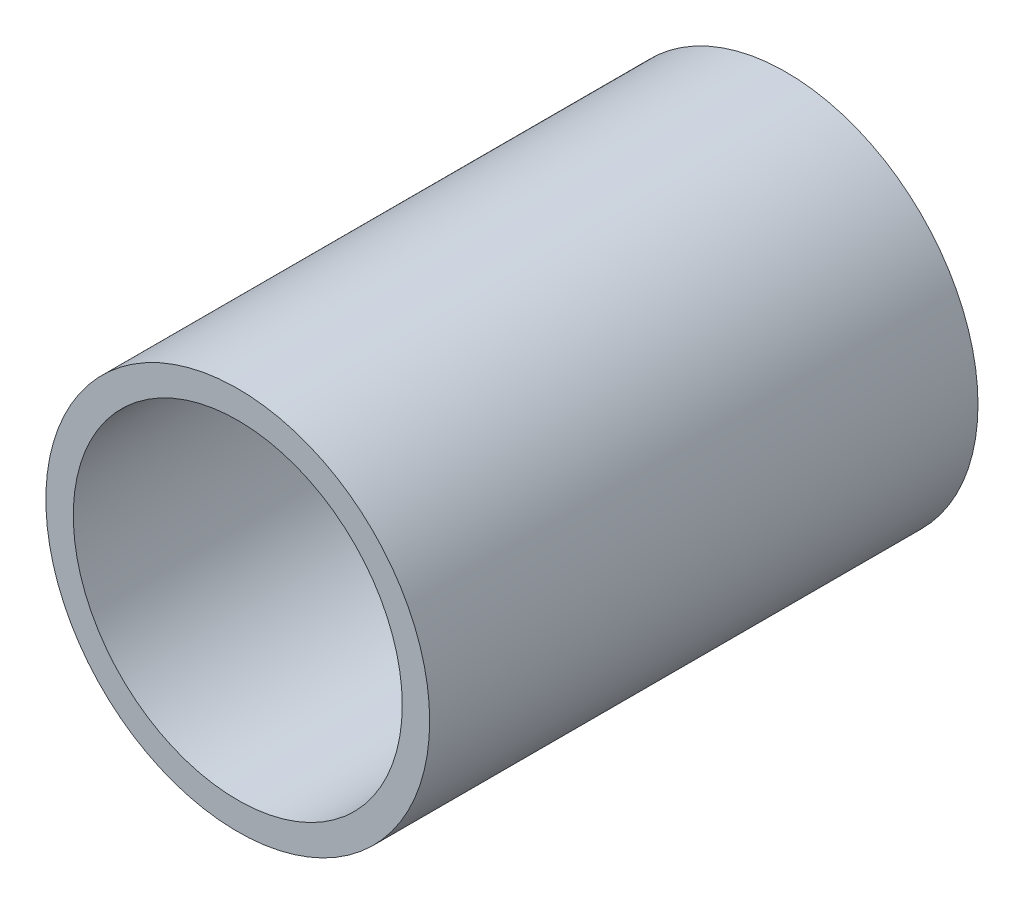
ISO-10303-21;
HEADER;
FILE_DESCRIPTION(('STEP AP214'),'2;1');
FILE_NAME('part.step','',(''),(''),'','','');
FILE_SCHEMA(('AUTOMOTIVE_DESIGN { 1 0 10303 214 1 1 1 1 }'));
ENDSEC;
DATA;
#1=APPLICATION_CONTEXT('core data for automotive mechanical design processes');
#2=APPLICATION_PROTOCOL_DEFINITION('international standard','automotive_design',2000,#1);
#3=PRODUCT_CONTEXT('',#1,'mechanical');
#4=PRODUCT('Part','Part','',(#3));
#5=PRODUCT_RELATED_PRODUCT_CATEGORY('part','',(#4));
#6=PRODUCT_DEFINITION_FORMATION('','',#4);
#7=PRODUCT_DEFINITION_CONTEXT('part definition',#1,'design');
#8=PRODUCT_DEFINITION('design','',#6,#7);
#9=PRODUCT_DEFINITION_SHAPE('','',#8);
#10=(LENGTH_UNIT() NAMED_UNIT(*) SI_UNIT(.MILLI.,.METRE.));
#11=(NAMED_UNIT(*) PLANE_ANGLE_UNIT() SI_UNIT($,.RADIAN.));
#12=(NAMED_UNIT(*) SI_UNIT($,.STERADIAN.) SOLID_ANGLE_UNIT());
#13=UNCERTAINTY_MEASURE_WITH_UNIT(LENGTH_MEASURE(1.E-05),#10,'distance_accuracy_value','');
#14=(GEOMETRIC_REPRESENTATION_CONTEXT(3) GLOBAL_UNCERTAINTY_ASSIGNED_CONTEXT((#13)) GLOBAL_UNIT_ASSIGNED_CONTEXT((#10,
#11,#12)) REPRESENTATION_CONTEXT('',''));
#15=CARTESIAN_POINT('',(0.,0.,0.));
#16=DIRECTION('',(0.,0.,1.));
#17=DIRECTION('',(1.,0.,0.));
#18=AXIS2_PLACEMENT_3D('',#15,#16,#17);
#19=CARTESIAN_POINT('',(0.,0.,25.4));
#20=DIRECTION('',(0.,0.,-1.));
#21=DIRECTION('',(-1.,0.,0.));
#22=AXIS2_PLACEMENT_3D('',#19,#20,#21);
#23=CYLINDRICAL_SURFACE('',#22,8.89);
#24=CARTESIAN_POINT('',(0.,0.,25.4));
#25=DIRECTION('',(0.,0.,1.));
#26=DIRECTION('',(1.,0.,0.));
#27=AXIS2_PLACEMENT_3D('',#24,#25,#26);
#28=CIRCLE('',#27,8.89);
#29=CARTESIAN_POINT('',(8.89,0.,25.4));
#30=VERTEX_POINT('',#29);
#31=EDGE_CURVE('E10',#30,#30,#28,.T.);
#32=ORIENTED_EDGE('',*,*,#31,.F.);
#33=EDGE_LOOP('',(#32));
#34=FACE_BOUND('',#33,.T.);
#35=CARTESIAN_POINT('',(0.,0.,0.));
#36=DIRECTION('',(0.,0.,1.));
#37=DIRECTION('',(1.,0.,0.));
#38=AXIS2_PLACEMENT_3D('',#35,#36,#37);
#39=CIRCLE('',#38,8.89);
#40=CARTESIAN_POINT('',(8.89,0.,0.));
#41=VERTEX_POINT('',#40);
#42=EDGE_CURVE('E51',#41,#41,#39,.T.);
#43=ORIENTED_EDGE('',*,*,#42,.T.);
#44=EDGE_LOOP('',(#43));
#45=FACE_BOUND('',#44,.T.);
#46=ADVANCED_FACE('F43',(#34,#45),#23,.T.);
#47=CARTESIAN_POINT('',(0.,0.,25.4));
#48=DIRECTION('',(0.,0.,1.));
#49=DIRECTION('',(1.,0.,0.));
#50=AXIS2_PLACEMENT_3D('',#47,#48,#49);
#51=PLANE('',#50);
#52=CARTESIAN_POINT('',(0.,0.,25.4));
#53=DIRECTION('',(0.,0.,1.));
#54=DIRECTION('',(1.,0.,0.));
#55=AXIS2_PLACEMENT_3D('',#52,#53,#54);
#56=CIRCLE('',#55,7.62);
#57=CARTESIAN_POINT('',(7.62,0.,25.4));
#58=VERTEX_POINT('',#57);
#59=EDGE_CURVE('E58',#58,#58,#56,.T.);
#60=ORIENTED_EDGE('',*,*,#59,.F.);
#61=EDGE_LOOP('',(#60));
#62=FACE_BOUND('',#61,.T.);
#63=ORIENTED_EDGE('',*,*,#31,.T.);
#64=EDGE_LOOP('',(#63));
#65=FACE_BOUND('',#64,.T.);
#66=ADVANCED_FACE('F76',(#62,#65),#51,.T.);
#67=CARTESIAN_POINT('',(0.,0.,0.));
#68=DIRECTION('',(0.,0.,1.));
#69=DIRECTION('',(1.,0.,0.));
#70=AXIS2_PLACEMENT_3D('',#67,#68,#69);
#71=PLANE('',#70);
#72=CARTESIAN_POINT('',(0.,0.,0.));
#73=DIRECTION('',(0.,0.,1.));
#74=DIRECTION('',(1.,0.,0.));
#75=AXIS2_PLACEMENT_3D('',#72,#73,#74);
#76=CIRCLE('',#75,7.62);
#77=CARTESIAN_POINT('',(7.62,0.,0.));
#78=VERTEX_POINT('',#77);
#79=EDGE_CURVE('E46',#78,#78,#76,.T.);
#80=ORIENTED_EDGE('',*,*,#79,.T.);
#81=EDGE_LOOP('',(#80));
#82=FACE_BOUND('',#81,.T.);
#83=ORIENTED_EDGE('',*,*,#42,.F.);
#84=EDGE_LOOP('',(#83));
#85=FACE_BOUND('',#84,.T.);
#86=ADVANCED_FACE('F67',(#82,#85),#71,.F.);
#87=CARTESIAN_POINT('',(0.,0.,-9.90600000000001));
#88=DIRECTION('',(0.,0.,1.));
#89=DIRECTION('',(1.,0.,0.));
#90=AXIS2_PLACEMENT_3D('',#87,#88,#89);
#91=CYLINDRICAL_SURFACE('',#90,7.62);
#92=ORIENTED_EDGE('',*,*,#59,.T.);
#93=EDGE_LOOP('',(#92));
#94=FACE_BOUND('',#93,.T.);
#95=ORIENTED_EDGE('',*,*,#79,.F.);
#96=EDGE_LOOP('',(#95));
#97=FACE_BOUND('',#96,.T.);
#98=ADVANCED_FACE('F70',(#94,#97),#91,.F.);
#99=CLOSED_SHELL('',(#46,#66,#86,#98));
#100=MANIFOLD_SOLID_BREP('B2',#99);
#101=ADVANCED_BREP_SHAPE_REPRESENTATION('',(#18,#100),#14);
#102=SHAPE_DEFINITION_REPRESENTATION(#9,#101);
ENDSEC;
END-ISO-10303-21;
